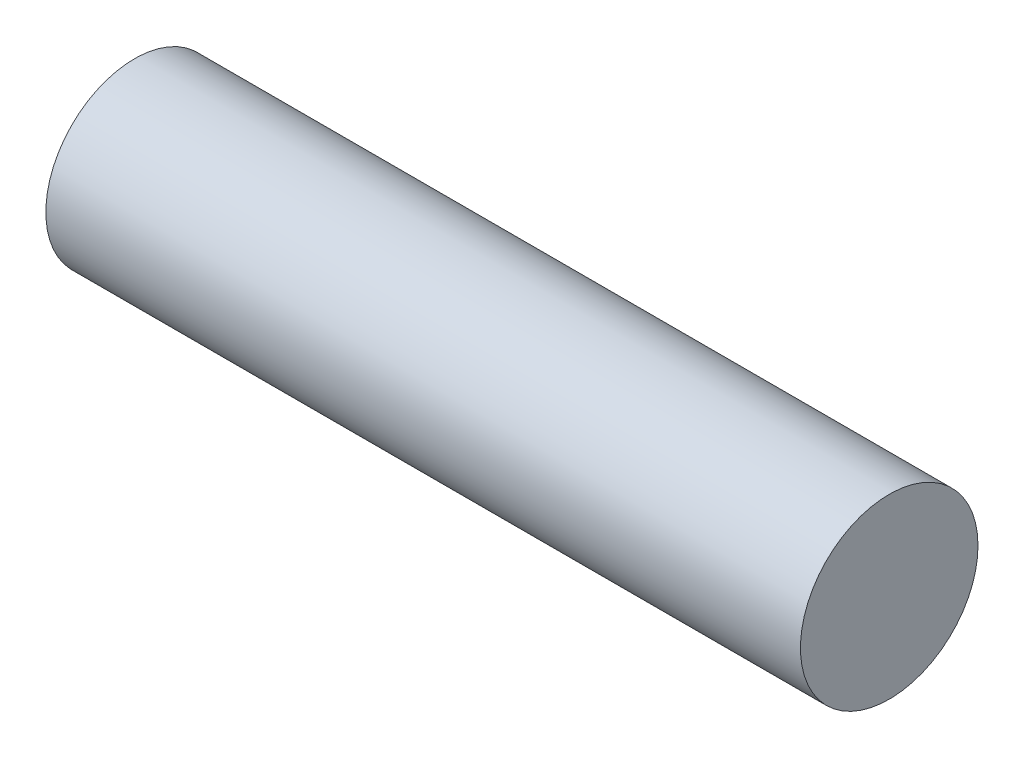
ISO-10303-21;
HEADER;
FILE_DESCRIPTION(('STEP AP214'),'2;1');
FILE_NAME('part.step','',(''),(''),'','','');
FILE_SCHEMA(('AUTOMOTIVE_DESIGN { 1 0 10303 214 1 1 1 1 }'));
ENDSEC;
DATA;
#1=APPLICATION_CONTEXT('core data for automotive mechanical design processes');
#2=APPLICATION_PROTOCOL_DEFINITION('international standard','automotive_design',2000,#1);
#3=PRODUCT_CONTEXT('',#1,'mechanical');
#4=PRODUCT('Part','Part','',(#3));
#5=PRODUCT_RELATED_PRODUCT_CATEGORY('part','',(#4));
#6=PRODUCT_DEFINITION_FORMATION('','',#4);
#7=PRODUCT_DEFINITION_CONTEXT('part definition',#1,'design');
#8=PRODUCT_DEFINITION('design','',#6,#7);
#9=PRODUCT_DEFINITION_SHAPE('','',#8);
#10=(LENGTH_UNIT() NAMED_UNIT(*) SI_UNIT(.MILLI.,.METRE.));
#11=(NAMED_UNIT(*) PLANE_ANGLE_UNIT() SI_UNIT($,.RADIAN.));
#12=(NAMED_UNIT(*) SI_UNIT($,.STERADIAN.) SOLID_ANGLE_UNIT());
#13=UNCERTAINTY_MEASURE_WITH_UNIT(LENGTH_MEASURE(1.E-05),#10,'distance_accuracy_value','');
#14=(GEOMETRIC_REPRESENTATION_CONTEXT(3) GLOBAL_UNCERTAINTY_ASSIGNED_CONTEXT((#13)) GLOBAL_UNIT_ASSIGNED_CONTEXT((#10,
#11,#12)) REPRESENTATION_CONTEXT('',''));
#15=CARTESIAN_POINT('',(0.,0.,0.));
#16=DIRECTION('',(0.,0.,1.));
#17=DIRECTION('',(1.,0.,0.));
#18=AXIS2_PLACEMENT_3D('',#15,#16,#17);
#19=CARTESIAN_POINT('',(17.,0.,0.));
#20=DIRECTION('',(-1.,0.,0.));
#21=DIRECTION('',(0.,0.,1.));
#22=AXIS2_PLACEMENT_3D('',#19,#20,#21);
#23=CYLINDRICAL_SURFACE('',#22,2.);
#24=CARTESIAN_POINT('',(17.,0.,0.));
#25=DIRECTION('',(1.,0.,0.));
#26=DIRECTION('',(0.,0.,-1.));
#27=AXIS2_PLACEMENT_3D('',#24,#25,#26);
#28=CIRCLE('',#27,2.);
#29=CARTESIAN_POINT('',(17.,0.,-2.));
#30=VERTEX_POINT('',#29);
#31=EDGE_CURVE('E10',#30,#30,#28,.T.);
#32=ORIENTED_EDGE('',*,*,#31,.F.);
#33=EDGE_LOOP('',(#32));
#34=FACE_BOUND('',#33,.T.);
#35=CARTESIAN_POINT('',(0.,0.,0.));
#36=DIRECTION('',(1.,0.,0.));
#37=DIRECTION('',(0.,0.,-1.));
#38=AXIS2_PLACEMENT_3D('',#35,#36,#37);
#39=CIRCLE('',#38,2.);
#40=CARTESIAN_POINT('',(0.,0.,-2.));
#41=VERTEX_POINT('',#40);
#42=EDGE_CURVE('E33',#41,#41,#39,.T.);
#43=ORIENTED_EDGE('',*,*,#42,.T.);
#44=EDGE_LOOP('',(#43));
#45=FACE_BOUND('',#44,.T.);
#46=ADVANCED_FACE('F30',(#34,#45),#23,.T.);
#47=CARTESIAN_POINT('',(17.,0.,0.));
#48=DIRECTION('',(1.,0.,0.));
#49=DIRECTION('',(0.,0.,-1.));
#50=AXIS2_PLACEMENT_3D('',#47,#48,#49);
#51=PLANE('',#50);
#52=ORIENTED_EDGE('',*,*,#31,.T.);
#53=EDGE_LOOP('',(#52));
#54=FACE_BOUND('',#53,.T.);
#55=ADVANCED_FACE('F45',(#54),#51,.T.);
#56=CARTESIAN_POINT('',(0.,0.,0.));
#57=DIRECTION('',(1.,0.,0.));
#58=DIRECTION('',(0.,0.,-1.));
#59=AXIS2_PLACEMENT_3D('',#56,#57,#58);
#60=PLANE('',#59);
#61=ORIENTED_EDGE('',*,*,#42,.F.);
#62=EDGE_LOOP('',(#61));
#63=FACE_BOUND('',#62,.T.);
#64=ADVANCED_FACE('F43',(#63),#60,.F.);
#65=CLOSED_SHELL('',(#46,#55,#64));
#66=MANIFOLD_SOLID_BREP('B2',#65);
#67=ADVANCED_BREP_SHAPE_REPRESENTATION('',(#18,#66),#14);
#68=SHAPE_DEFINITION_REPRESENTATION(#9,#67);
ENDSEC;
END-ISO-10303-21;
